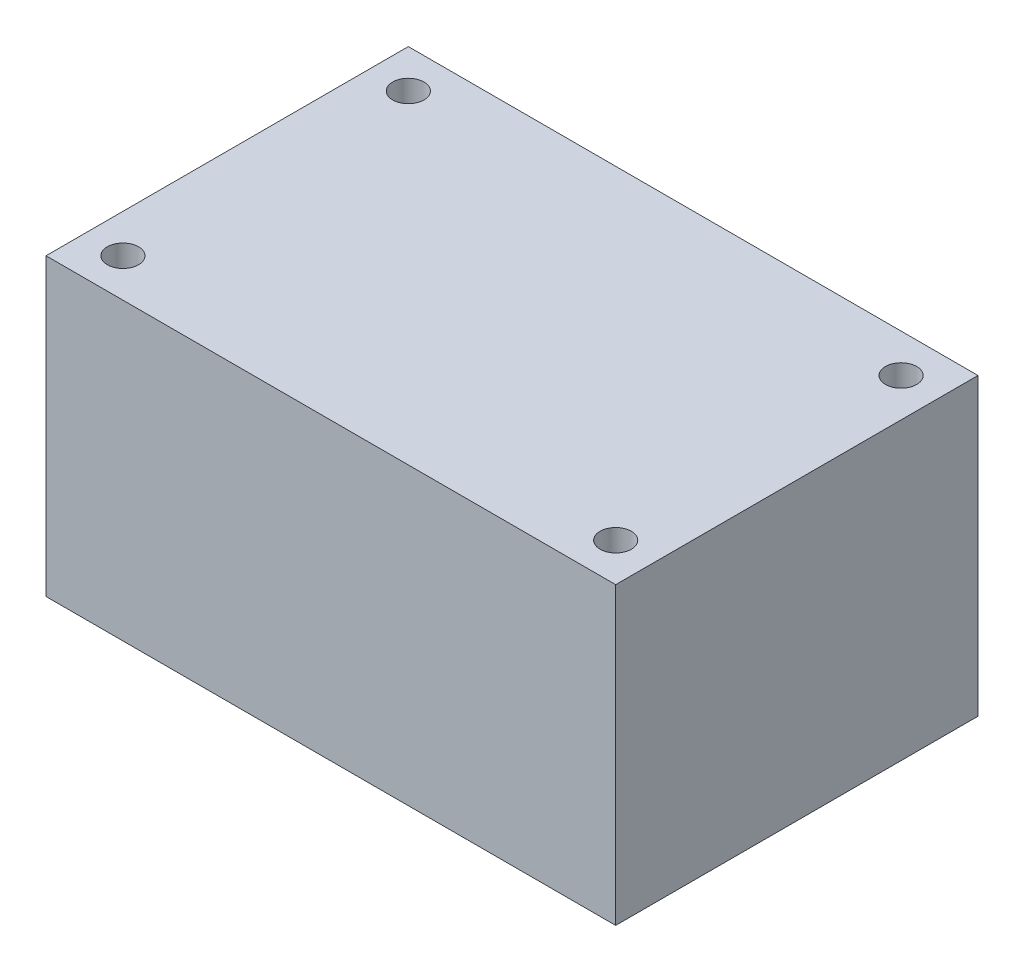
ISO-10303-21;
HEADER;
FILE_DESCRIPTION(('STEP AP214'),'2;1');
FILE_NAME('part.step','',(''),(''),'','','');
FILE_SCHEMA(('AUTOMOTIVE_DESIGN { 1 0 10303 214 1 1 1 1 }'));
ENDSEC;
DATA;
#1=APPLICATION_CONTEXT('core data for automotive mechanical design processes');
#2=APPLICATION_PROTOCOL_DEFINITION('international standard','automotive_design',2000,#1);
#3=PRODUCT_CONTEXT('',#1,'mechanical');
#4=PRODUCT('Part','Part','',(#3));
#5=PRODUCT_RELATED_PRODUCT_CATEGORY('part','',(#4));
#6=PRODUCT_DEFINITION_FORMATION('','',#4);
#7=PRODUCT_DEFINITION_CONTEXT('part definition',#1,'design');
#8=PRODUCT_DEFINITION('design','',#6,#7);
#9=PRODUCT_DEFINITION_SHAPE('','',#8);
#10=(LENGTH_UNIT() NAMED_UNIT(*) SI_UNIT(.MILLI.,.METRE.));
#11=(NAMED_UNIT(*) PLANE_ANGLE_UNIT() SI_UNIT($,.RADIAN.));
#12=(NAMED_UNIT(*) SI_UNIT($,.STERADIAN.) SOLID_ANGLE_UNIT());
#13=UNCERTAINTY_MEASURE_WITH_UNIT(LENGTH_MEASURE(1.E-05),#10,'distance_accuracy_value','');
#14=(GEOMETRIC_REPRESENTATION_CONTEXT(3) GLOBAL_UNCERTAINTY_ASSIGNED_CONTEXT((#13)) GLOBAL_UNIT_ASSIGNED_CONTEXT((#10,
#11,#12)) REPRESENTATION_CONTEXT('',''));
#15=CARTESIAN_POINT('',(0.,0.,0.));
#16=DIRECTION('',(0.,0.,1.));
#17=DIRECTION('',(1.,0.,0.));
#18=AXIS2_PLACEMENT_3D('',#15,#16,#17);
#19=CARTESIAN_POINT('',(0.,30.,0.));
#20=DIRECTION('',(0.,1.,0.));
#21=DIRECTION('',(0.,0.,1.));
#22=AXIS2_PLACEMENT_3D('',#19,#20,#21);
#23=PLANE('',#22);
#24=CARTESIAN_POINT('',(25.045,30.,14.505));
#25=DIRECTION('',(0.,1.,0.));
#26=DIRECTION('',(0.,0.,1.));
#27=AXIS2_PLACEMENT_3D('',#24,#25,#26);
#28=CIRCLE('',#27,1.5875);
#29=CARTESIAN_POINT('',(25.045,30.,16.0925));
#30=VERTEX_POINT('',#29);
#31=EDGE_CURVE('E121',#30,#30,#28,.T.);
#32=ORIENTED_EDGE('',*,*,#31,.F.);
#33=EDGE_LOOP('',(#32));
#34=FACE_BOUND('',#33,.T.);
#35=CARTESIAN_POINT('',(-25.045,30.,-14.505));
#36=DIRECTION('',(0.,1.,0.));
#37=DIRECTION('',(0.,0.,1.));
#38=AXIS2_PLACEMENT_3D('',#35,#36,#37);
#39=CIRCLE('',#38,1.5875);
#40=CARTESIAN_POINT('',(-25.045,30.,-12.9175));
#41=VERTEX_POINT('',#40);
#42=EDGE_CURVE('E100',#41,#41,#39,.T.);
#43=ORIENTED_EDGE('',*,*,#42,.F.);
#44=EDGE_LOOP('',(#43));
#45=FACE_BOUND('',#44,.T.);
#46=DIRECTION('',(0.,0.,-1.));
#47=VECTOR('',#46,1.);
#48=CARTESIAN_POINT('',(28.955,30.,-18.415));
#49=LINE('',#48,#47);
#50=CARTESIAN_POINT('',(28.955,30.,18.415));
#51=VERTEX_POINT('',#50);
#52=CARTESIAN_POINT('',(28.955,30.,-18.415));
#53=VERTEX_POINT('',#52);
#54=EDGE_CURVE('E85',#51,#53,#49,.T.);
#55=ORIENTED_EDGE('',*,*,#54,.T.);
#56=DIRECTION('',(-1.,0.,0.));
#57=VECTOR('',#56,1.);
#58=CARTESIAN_POINT('',(-28.955,30.,-18.415));
#59=LINE('',#58,#57);
#60=CARTESIAN_POINT('',(-28.955,30.,-18.415));
#61=VERTEX_POINT('',#60);
#62=EDGE_CURVE('E80',#53,#61,#59,.T.);
#63=ORIENTED_EDGE('',*,*,#62,.T.);
#64=DIRECTION('',(0.,0.,1.));
#65=VECTOR('',#64,1.);
#66=CARTESIAN_POINT('',(-28.955,30.,-18.415));
#67=LINE('',#66,#65);
#68=CARTESIAN_POINT('',(-28.955,30.,18.415));
#69=VERTEX_POINT('',#68);
#70=EDGE_CURVE('E83',#61,#69,#67,.T.);
#71=ORIENTED_EDGE('',*,*,#70,.T.);
#72=DIRECTION('',(1.,0.,0.));
#73=VECTOR('',#72,1.);
#74=CARTESIAN_POINT('',(-28.955,30.,18.415));
#75=LINE('',#74,#73);
#76=EDGE_CURVE('E50',#69,#51,#75,.T.);
#77=ORIENTED_EDGE('',*,*,#76,.T.);
#78=EDGE_LOOP('',(#55,#63,#71,#77));
#79=FACE_BOUND('',#78,.T.);
#80=CARTESIAN_POINT('',(25.045,30.,-14.505));
#81=DIRECTION('',(0.,1.,0.));
#82=DIRECTION('',(0.,0.,1.));
#83=AXIS2_PLACEMENT_3D('',#80,#81,#82);
#84=CIRCLE('',#83,1.5875);
#85=CARTESIAN_POINT('',(25.045,30.,-12.9175));
#86=VERTEX_POINT('',#85);
#87=EDGE_CURVE('E115',#86,#86,#84,.T.);
#88=ORIENTED_EDGE('',*,*,#87,.F.);
#89=EDGE_LOOP('',(#88));
#90=FACE_BOUND('',#89,.T.);
#91=CARTESIAN_POINT('',(-25.045,30.,14.505));
#92=DIRECTION('',(0.,1.,0.));
#93=DIRECTION('',(0.,0.,1.));
#94=AXIS2_PLACEMENT_3D('',#91,#92,#93);
#95=CIRCLE('',#94,1.5875);
#96=CARTESIAN_POINT('',(-25.045,30.,16.0925));
#97=VERTEX_POINT('',#96);
#98=EDGE_CURVE('E127',#97,#97,#95,.T.);
#99=ORIENTED_EDGE('',*,*,#98,.F.);
#100=EDGE_LOOP('',(#99));
#101=FACE_BOUND('',#100,.T.);
#102=ADVANCED_FACE('F33',(#34,#45,#79,#90,#101),#23,.T.);
#103=CARTESIAN_POINT('',(0.,0.,0.));
#104=DIRECTION('',(0.,1.,0.));
#105=DIRECTION('',(0.,0.,1.));
#106=AXIS2_PLACEMENT_3D('',#103,#104,#105);
#107=PLANE('',#106);
#108=DIRECTION('',(0.,0.,-1.));
#109=VECTOR('',#108,1.);
#110=CARTESIAN_POINT('',(28.955,0.,-18.415));
#111=LINE('',#110,#109);
#112=CARTESIAN_POINT('',(28.955,0.,18.415));
#113=VERTEX_POINT('',#112);
#114=CARTESIAN_POINT('',(28.955,0.,-18.415));
#115=VERTEX_POINT('',#114);
#116=EDGE_CURVE('E97',#113,#115,#111,.T.);
#117=ORIENTED_EDGE('',*,*,#116,.F.);
#118=DIRECTION('',(1.,0.,0.));
#119=VECTOR('',#118,1.);
#120=CARTESIAN_POINT('',(-28.955,0.,18.415));
#121=LINE('',#120,#119);
#122=CARTESIAN_POINT('',(-28.955,0.,18.415));
#123=VERTEX_POINT('',#122);
#124=EDGE_CURVE('E73',#123,#113,#121,.T.);
#125=ORIENTED_EDGE('',*,*,#124,.F.);
#126=DIRECTION('',(0.,0.,1.));
#127=VECTOR('',#126,1.);
#128=CARTESIAN_POINT('',(-28.955,0.,-18.415));
#129=LINE('',#128,#127);
#130=CARTESIAN_POINT('',(-28.955,0.,-18.415));
#131=VERTEX_POINT('',#130);
#132=EDGE_CURVE('E67',#131,#123,#129,.T.);
#133=ORIENTED_EDGE('',*,*,#132,.F.);
#134=DIRECTION('',(-1.,0.,0.));
#135=VECTOR('',#134,1.);
#136=CARTESIAN_POINT('',(-28.955,0.,-18.415));
#137=LINE('',#136,#135);
#138=EDGE_CURVE('E89',#115,#131,#137,.T.);
#139=ORIENTED_EDGE('',*,*,#138,.F.);
#140=EDGE_LOOP('',(#117,#125,#133,#139));
#141=FACE_BOUND('',#140,.T.);
#142=CARTESIAN_POINT('',(-25.045,0.,-14.505));
#143=DIRECTION('',(0.,1.,0.));
#144=DIRECTION('',(0.,0.,1.));
#145=AXIS2_PLACEMENT_3D('',#142,#143,#144);
#146=CIRCLE('',#145,1.5875);
#147=CARTESIAN_POINT('',(-25.045,0.,-12.9175));
#148=VERTEX_POINT('',#147);
#149=EDGE_CURVE('E112',#148,#148,#146,.T.);
#150=ORIENTED_EDGE('',*,*,#149,.T.);
#151=EDGE_LOOP('',(#150));
#152=FACE_BOUND('',#151,.T.);
#153=CARTESIAN_POINT('',(25.045,0.,-14.505));
#154=DIRECTION('',(0.,1.,0.));
#155=DIRECTION('',(0.,0.,1.));
#156=AXIS2_PLACEMENT_3D('',#153,#154,#155);
#157=CIRCLE('',#156,1.5875);
#158=CARTESIAN_POINT('',(25.045,0.,-12.9175));
#159=VERTEX_POINT('',#158);
#160=EDGE_CURVE('E118',#159,#159,#157,.T.);
#161=ORIENTED_EDGE('',*,*,#160,.T.);
#162=EDGE_LOOP('',(#161));
#163=FACE_BOUND('',#162,.T.);
#164=CARTESIAN_POINT('',(25.045,0.,14.505));
#165=DIRECTION('',(0.,1.,0.));
#166=DIRECTION('',(0.,0.,1.));
#167=AXIS2_PLACEMENT_3D('',#164,#165,#166);
#168=CIRCLE('',#167,1.5875);
#169=CARTESIAN_POINT('',(25.045,0.,16.0925));
#170=VERTEX_POINT('',#169);
#171=EDGE_CURVE('E124',#170,#170,#168,.T.);
#172=ORIENTED_EDGE('',*,*,#171,.T.);
#173=EDGE_LOOP('',(#172));
#174=FACE_BOUND('',#173,.T.);
#175=CARTESIAN_POINT('',(-25.045,0.,14.505));
#176=DIRECTION('',(0.,1.,0.));
#177=DIRECTION('',(0.,0.,1.));
#178=AXIS2_PLACEMENT_3D('',#175,#176,#177);
#179=CIRCLE('',#178,1.5875);
#180=CARTESIAN_POINT('',(-25.045,0.,16.0925));
#181=VERTEX_POINT('',#180);
#182=EDGE_CURVE('E130',#181,#181,#179,.T.);
#183=ORIENTED_EDGE('',*,*,#182,.T.);
#184=EDGE_LOOP('',(#183));
#185=FACE_BOUND('',#184,.T.);
#186=ADVANCED_FACE('F108',(#141,#152,#163,#174,#185),#107,.F.);
#187=CARTESIAN_POINT('',(28.955,30.,-18.415));
#188=DIRECTION('',(-1.,0.,0.));
#189=DIRECTION('',(0.,0.,1.));
#190=AXIS2_PLACEMENT_3D('',#187,#188,#189);
#191=PLANE('',#190);
#192=ORIENTED_EDGE('',*,*,#116,.T.);
#193=DIRECTION('',(0.,-1.,0.));
#194=VECTOR('',#193,1.);
#195=CARTESIAN_POINT('',(28.955,30.,-18.415));
#196=LINE('',#195,#194);
#197=EDGE_CURVE('E11',#53,#115,#196,.T.);
#198=ORIENTED_EDGE('',*,*,#197,.F.);
#199=ORIENTED_EDGE('',*,*,#54,.F.);
#200=DIRECTION('',(0.,-1.,0.));
#201=VECTOR('',#200,1.);
#202=CARTESIAN_POINT('',(28.955,30.,18.415));
#203=LINE('',#202,#201);
#204=EDGE_CURVE('E93',#51,#113,#203,.T.);
#205=ORIENTED_EDGE('',*,*,#204,.T.);
#206=EDGE_LOOP('',(#192,#198,#199,#205));
#207=FACE_BOUND('',#206,.T.);
#208=ADVANCED_FACE('F35',(#207),#191,.F.);
#209=CARTESIAN_POINT('',(-28.955,30.,-18.415));
#210=DIRECTION('',(0.,0.,1.));
#211=DIRECTION('',(1.,0.,0.));
#212=AXIS2_PLACEMENT_3D('',#209,#210,#211);
#213=PLANE('',#212);
#214=ORIENTED_EDGE('',*,*,#138,.T.);
#215=DIRECTION('',(0.,-1.,0.));
#216=VECTOR('',#215,1.);
#217=CARTESIAN_POINT('',(-28.955,30.,-18.415));
#218=LINE('',#217,#216);
#219=EDGE_CURVE('E42',#61,#131,#218,.T.);
#220=ORIENTED_EDGE('',*,*,#219,.F.);
#221=ORIENTED_EDGE('',*,*,#62,.F.);
#222=ORIENTED_EDGE('',*,*,#197,.T.);
#223=EDGE_LOOP('',(#214,#220,#221,#222));
#224=FACE_BOUND('',#223,.T.);
#225=ADVANCED_FACE('F88',(#224),#213,.F.);
#226=CARTESIAN_POINT('',(-28.955,30.,-18.415));
#227=DIRECTION('',(1.,0.,0.));
#228=DIRECTION('',(0.,0.,-1.));
#229=AXIS2_PLACEMENT_3D('',#226,#227,#228);
#230=PLANE('',#229);
#231=ORIENTED_EDGE('',*,*,#132,.T.);
#232=DIRECTION('',(0.,-1.,0.));
#233=VECTOR('',#232,1.);
#234=CARTESIAN_POINT('',(-28.955,30.,18.415));
#235=LINE('',#234,#233);
#236=EDGE_CURVE('E90',#69,#123,#235,.T.);
#237=ORIENTED_EDGE('',*,*,#236,.F.);
#238=ORIENTED_EDGE('',*,*,#70,.F.);
#239=ORIENTED_EDGE('',*,*,#219,.T.);
#240=EDGE_LOOP('',(#231,#237,#238,#239));
#241=FACE_BOUND('',#240,.T.);
#242=ADVANCED_FACE('F91',(#241),#230,.F.);
#243=CARTESIAN_POINT('',(-28.955,30.,18.415));
#244=DIRECTION('',(0.,0.,-1.));
#245=DIRECTION('',(-1.,0.,0.));
#246=AXIS2_PLACEMENT_3D('',#243,#244,#245);
#247=PLANE('',#246);
#248=ORIENTED_EDGE('',*,*,#124,.T.);
#249=ORIENTED_EDGE('',*,*,#204,.F.);
#250=ORIENTED_EDGE('',*,*,#76,.F.);
#251=ORIENTED_EDGE('',*,*,#236,.T.);
#252=EDGE_LOOP('',(#248,#249,#250,#251));
#253=FACE_BOUND('',#252,.T.);
#254=ADVANCED_FACE('F105',(#253),#247,.F.);
#255=CARTESIAN_POINT('',(-25.045,30.,-14.505));
#256=DIRECTION('',(0.,-1.,0.));
#257=DIRECTION('',(0.,0.,-1.));
#258=AXIS2_PLACEMENT_3D('',#255,#256,#257);
#259=CYLINDRICAL_SURFACE('',#258,1.5875);
#260=ORIENTED_EDGE('',*,*,#42,.T.);
#261=EDGE_LOOP('',(#260));
#262=FACE_BOUND('',#261,.T.);
#263=ORIENTED_EDGE('',*,*,#149,.F.);
#264=EDGE_LOOP('',(#263));
#265=FACE_BOUND('',#264,.T.);
#266=ADVANCED_FACE('F149',(#262,#265),#259,.F.);
#267=CARTESIAN_POINT('',(25.045,30.,-14.505));
#268=DIRECTION('',(0.,-1.,0.));
#269=DIRECTION('',(0.,0.,-1.));
#270=AXIS2_PLACEMENT_3D('',#267,#268,#269);
#271=CYLINDRICAL_SURFACE('',#270,1.5875);
#272=ORIENTED_EDGE('',*,*,#87,.T.);
#273=EDGE_LOOP('',(#272));
#274=FACE_BOUND('',#273,.T.);
#275=ORIENTED_EDGE('',*,*,#160,.F.);
#276=EDGE_LOOP('',(#275));
#277=FACE_BOUND('',#276,.T.);
#278=ADVANCED_FACE('F195',(#274,#277),#271,.F.);
#279=CARTESIAN_POINT('',(25.045,30.,14.505));
#280=DIRECTION('',(0.,-1.,0.));
#281=DIRECTION('',(0.,0.,-1.));
#282=AXIS2_PLACEMENT_3D('',#279,#280,#281);
#283=CYLINDRICAL_SURFACE('',#282,1.5875);
#284=ORIENTED_EDGE('',*,*,#31,.T.);
#285=EDGE_LOOP('',(#284));
#286=FACE_BOUND('',#285,.T.);
#287=ORIENTED_EDGE('',*,*,#171,.F.);
#288=EDGE_LOOP('',(#287));
#289=FACE_BOUND('',#288,.T.);
#290=ADVANCED_FACE('F203',(#286,#289),#283,.F.);
#291=CARTESIAN_POINT('',(-25.045,30.,14.505));
#292=DIRECTION('',(0.,-1.,0.));
#293=DIRECTION('',(0.,0.,-1.));
#294=AXIS2_PLACEMENT_3D('',#291,#292,#293);
#295=CYLINDRICAL_SURFACE('',#294,1.5875);
#296=ORIENTED_EDGE('',*,*,#98,.T.);
#297=EDGE_LOOP('',(#296));
#298=FACE_BOUND('',#297,.T.);
#299=ORIENTED_EDGE('',*,*,#182,.F.);
#300=EDGE_LOOP('',(#299));
#301=FACE_BOUND('',#300,.T.);
#302=ADVANCED_FACE('F136',(#298,#301),#295,.F.);
#303=CLOSED_SHELL('',(#102,#186,#208,#225,#242,#254,#266,#278,#290,#302));
#304=MANIFOLD_SOLID_BREP('B2',#303);
#305=ADVANCED_BREP_SHAPE_REPRESENTATION('',(#18,#304),#14);
#306=SHAPE_DEFINITION_REPRESENTATION(#9,#305);
ENDSEC;
END-ISO-10303-21;
